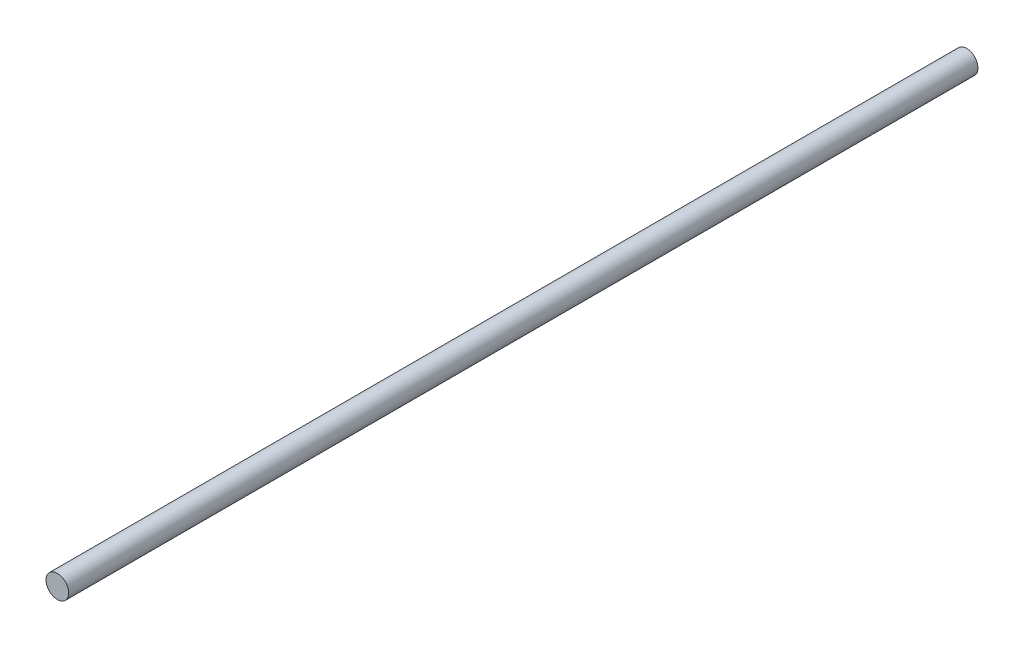
ISO-10303-21;
HEADER;
FILE_DESCRIPTION(('STEP AP214'),'2;1');
FILE_NAME('part.step','',(''),(''),'','','');
FILE_SCHEMA(('AUTOMOTIVE_DESIGN { 1 0 10303 214 1 1 1 1 }'));
ENDSEC;
DATA;
#1=APPLICATION_CONTEXT('core data for automotive mechanical design processes');
#2=APPLICATION_PROTOCOL_DEFINITION('international standard','automotive_design',2000,#1);
#3=PRODUCT_CONTEXT('',#1,'mechanical');
#4=PRODUCT('Part','Part','',(#3));
#5=PRODUCT_RELATED_PRODUCT_CATEGORY('part','',(#4));
#6=PRODUCT_DEFINITION_FORMATION('','',#4);
#7=PRODUCT_DEFINITION_CONTEXT('part definition',#1,'design');
#8=PRODUCT_DEFINITION('design','',#6,#7);
#9=PRODUCT_DEFINITION_SHAPE('','',#8);
#10=(LENGTH_UNIT() NAMED_UNIT(*) SI_UNIT(.MILLI.,.METRE.));
#11=(NAMED_UNIT(*) PLANE_ANGLE_UNIT() SI_UNIT($,.RADIAN.));
#12=(NAMED_UNIT(*) SI_UNIT($,.STERADIAN.) SOLID_ANGLE_UNIT());
#13=UNCERTAINTY_MEASURE_WITH_UNIT(LENGTH_MEASURE(1.E-05),#10,'distance_accuracy_value','');
#14=(GEOMETRIC_REPRESENTATION_CONTEXT(3) GLOBAL_UNCERTAINTY_ASSIGNED_CONTEXT((#13)) GLOBAL_UNIT_ASSIGNED_CONTEXT((#10,
#11,#12)) REPRESENTATION_CONTEXT('',''));
#15=CARTESIAN_POINT('',(0.,0.,0.));
#16=DIRECTION('',(0.,0.,1.));
#17=DIRECTION('',(1.,0.,0.));
#18=AXIS2_PLACEMENT_3D('',#15,#16,#17);
#19=CARTESIAN_POINT('',(0.,0.,200.));
#20=DIRECTION('',(0.,0.,-1.));
#21=DIRECTION('',(-1.,0.,0.));
#22=AXIS2_PLACEMENT_3D('',#19,#20,#21);
#23=CYLINDRICAL_SURFACE('',#22,2.5);
#24=CARTESIAN_POINT('',(0.,0.,200.));
#25=DIRECTION('',(0.,0.,1.));
#26=DIRECTION('',(1.,0.,0.));
#27=AXIS2_PLACEMENT_3D('',#24,#25,#26);
#28=CIRCLE('',#27,2.5);
#29=CARTESIAN_POINT('',(2.5,0.,200.));
#30=VERTEX_POINT('',#29);
#31=EDGE_CURVE('E10',#30,#30,#28,.T.);
#32=ORIENTED_EDGE('',*,*,#31,.F.);
#33=EDGE_LOOP('',(#32));
#34=FACE_BOUND('',#33,.T.);
#35=CARTESIAN_POINT('',(0.,0.,0.));
#36=DIRECTION('',(0.,0.,1.));
#37=DIRECTION('',(1.,0.,0.));
#38=AXIS2_PLACEMENT_3D('',#35,#36,#37);
#39=CIRCLE('',#38,2.5);
#40=CARTESIAN_POINT('',(2.5,0.,0.));
#41=VERTEX_POINT('',#40);
#42=EDGE_CURVE('E40',#41,#41,#39,.T.);
#43=ORIENTED_EDGE('',*,*,#42,.T.);
#44=EDGE_LOOP('',(#43));
#45=FACE_BOUND('',#44,.T.);
#46=ADVANCED_FACE('F37',(#34,#45),#23,.T.);
#47=CARTESIAN_POINT('',(0.,0.,200.));
#48=DIRECTION('',(0.,0.,1.));
#49=DIRECTION('',(1.,0.,0.));
#50=AXIS2_PLACEMENT_3D('',#47,#48,#49);
#51=PLANE('',#50);
#52=ORIENTED_EDGE('',*,*,#31,.T.);
#53=EDGE_LOOP('',(#52));
#54=FACE_BOUND('',#53,.T.);
#55=ADVANCED_FACE('F52',(#54),#51,.T.);
#56=CARTESIAN_POINT('',(0.,0.,0.));
#57=DIRECTION('',(0.,0.,1.));
#58=DIRECTION('',(1.,0.,0.));
#59=AXIS2_PLACEMENT_3D('',#56,#57,#58);
#60=PLANE('',#59);
#61=ORIENTED_EDGE('',*,*,#42,.F.);
#62=EDGE_LOOP('',(#61));
#63=FACE_BOUND('',#62,.T.);
#64=ADVANCED_FACE('F50',(#63),#60,.F.);
#65=CLOSED_SHELL('',(#46,#55,#64));
#66=MANIFOLD_SOLID_BREP('B2',#65);
#67=ADVANCED_BREP_SHAPE_REPRESENTATION('',(#18,#66),#14);
#68=SHAPE_DEFINITION_REPRESENTATION(#9,#67);
ENDSEC;
END-ISO-10303-21;
